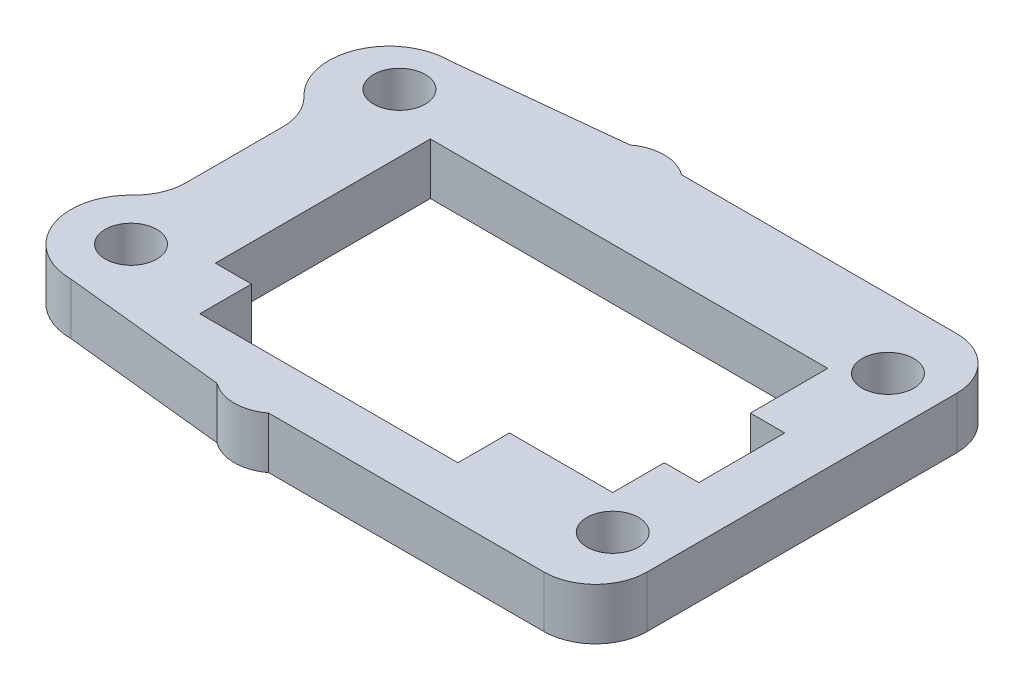
ISO-10303-21;
HEADER;
FILE_DESCRIPTION(('STEP AP214'),'2;1');
FILE_NAME('part.step','',(''),(''),'','','');
FILE_SCHEMA(('AUTOMOTIVE_DESIGN { 1 0 10303 214 1 1 1 1 }'));
ENDSEC;
DATA;
#1=APPLICATION_CONTEXT('core data for automotive mechanical design processes');
#2=APPLICATION_PROTOCOL_DEFINITION('international standard','automotive_design',2000,#1);
#3=PRODUCT_CONTEXT('',#1,'mechanical');
#4=PRODUCT('Part','Part','',(#3));
#5=PRODUCT_RELATED_PRODUCT_CATEGORY('part','',(#4));
#6=PRODUCT_DEFINITION_FORMATION('','',#4);
#7=PRODUCT_DEFINITION_CONTEXT('part definition',#1,'design');
#8=PRODUCT_DEFINITION('design','',#6,#7);
#9=PRODUCT_DEFINITION_SHAPE('','',#8);
#10=(LENGTH_UNIT() NAMED_UNIT(*) SI_UNIT(.MILLI.,.METRE.));
#11=(NAMED_UNIT(*) PLANE_ANGLE_UNIT() SI_UNIT($,.RADIAN.));
#12=(NAMED_UNIT(*) SI_UNIT($,.STERADIAN.) SOLID_ANGLE_UNIT());
#13=UNCERTAINTY_MEASURE_WITH_UNIT(LENGTH_MEASURE(1.E-05),#10,'distance_accuracy_value','');
#14=(GEOMETRIC_REPRESENTATION_CONTEXT(3) GLOBAL_UNCERTAINTY_ASSIGNED_CONTEXT((#13)) GLOBAL_UNIT_ASSIGNED_CONTEXT((#10,
#11,#12)) REPRESENTATION_CONTEXT('',''));
#15=CARTESIAN_POINT('',(0.,0.,0.));
#16=DIRECTION('',(0.,0.,1.));
#17=DIRECTION('',(1.,0.,0.));
#18=AXIS2_PLACEMENT_3D('',#15,#16,#17);
#19=CARTESIAN_POINT('',(41556.8612816487,58226.4576182088,11.5000000000123));
#20=DIRECTION('',(0.,-1.,0.));
#21=DIRECTION('',(1.,0.,0.));
#22=AXIS2_PLACEMENT_3D('',#19,#20,#21);
#23=PLANE('',#22);
#24=CARTESIAN_POINT('',(41574.3612816487,58226.4576182088,-6.4999999999884));
#25=DIRECTION('',(0.,-1.,0.));
#26=DIRECTION('',(1.,0.,0.));
#27=AXIS2_PLACEMENT_3D('',#24,#25,#26);
#28=CIRCLE('',#27,1.50000000000122);
#29=CARTESIAN_POINT('',(41575.8612816487,58226.4576182088,-6.4999999999884));
#30=VERTEX_POINT('',#29);
#31=EDGE_CURVE('E774',#30,#30,#28,.T.);
#32=ORIENTED_EDGE('',*,*,#31,.F.);
#33=EDGE_LOOP('',(#32));
#34=FACE_BOUND('',#33,.T.);
#35=DIRECTION('',(-1.,0.,0.));
#36=VECTOR('',#35,1.);
#37=CARTESIAN_POINT('',(41549.2612816491,58226.4576182088,7.50000000000739));
#38=LINE('',#37,#36);
#39=CARTESIAN_POINT('',(41551.3612816487,58226.4576182088,7.50000000000739));
#40=VERTEX_POINT('',#39);
#41=CARTESIAN_POINT('',(41549.2612816491,58226.4576182088,7.50000000000739));
#42=VERTEX_POINT('',#41);
#43=EDGE_CURVE('E219',#40,#42,#38,.T.);
#44=ORIENTED_EDGE('',*,*,#43,.F.);
#45=DIRECTION('',(0.,0.,-1.));
#46=VECTOR('',#45,1.);
#47=CARTESIAN_POINT('',(41551.3612816487,58226.4576182088,7.50000000000739));
#48=LINE('',#47,#46);
#49=CARTESIAN_POINT('',(41551.3612816487,58226.4576182088,10.5000000000075));
#50=VERTEX_POINT('',#49);
#51=EDGE_CURVE('E211',#50,#40,#48,.T.);
#52=ORIENTED_EDGE('',*,*,#51,.F.);
#53=DIRECTION('',(-1.,0.,0.));
#54=VECTOR('',#53,1.);
#55=CARTESIAN_POINT('',(41551.3612816487,58226.4576182088,10.5000000000075));
#56=LINE('',#55,#54);
#57=CARTESIAN_POINT('',(41566.3612816487,58226.4576182088,10.5000000000075));
#58=VERTEX_POINT('',#57);
#59=EDGE_CURVE('E254',#58,#50,#56,.T.);
#60=ORIENTED_EDGE('',*,*,#59,.F.);
#61=DIRECTION('',(0.,0.,1.));
#62=VECTOR('',#61,1.);
#63=CARTESIAN_POINT('',(41566.3612816487,58226.4576182088,10.5000000000075));
#64=LINE('',#63,#62);
#65=CARTESIAN_POINT('',(41566.3612816487,58226.4576182088,7.50000000000739));
#66=VERTEX_POINT('',#65);
#67=EDGE_CURVE('E252',#66,#58,#64,.T.);
#68=ORIENTED_EDGE('',*,*,#67,.F.);
#69=DIRECTION('',(-1.,0.,0.));
#70=VECTOR('',#69,1.);
#71=CARTESIAN_POINT('',(41566.3612816487,58226.4576182088,7.50000000000739));
#72=LINE('',#71,#70);
#73=CARTESIAN_POINT('',(41572.3612816487,58226.4576182088,7.50000000000739));
#74=VERTEX_POINT('',#73);
#75=EDGE_CURVE('E250',#74,#66,#72,.T.);
#76=ORIENTED_EDGE('',*,*,#75,.F.);
#77=DIRECTION('',(0.,0.,1.));
#78=VECTOR('',#77,1.);
#79=CARTESIAN_POINT('',(41572.3612816487,58226.4576182088,7.50000000000739));
#80=LINE('',#79,#78);
#81=CARTESIAN_POINT('',(41572.3612816487,58226.4576182088,4.50000000000728));
#82=VERTEX_POINT('',#81);
#83=EDGE_CURVE('E248',#82,#74,#80,.T.);
#84=ORIENTED_EDGE('',*,*,#83,.F.);
#85=DIRECTION('',(-1.,0.,0.));
#86=VECTOR('',#85,1.);
#87=CARTESIAN_POINT('',(41572.3612816487,58226.4576182088,4.50000000000728));
#88=LINE('',#87,#86);
#89=CARTESIAN_POINT('',(41574.3612816487,58226.4576182088,4.50000000000728));
#90=VERTEX_POINT('',#89);
#91=EDGE_CURVE('E246',#90,#82,#88,.T.);
#92=ORIENTED_EDGE('',*,*,#91,.F.);
#93=DIRECTION('',(0.,0.,1.));
#94=VECTOR('',#93,1.);
#95=CARTESIAN_POINT('',(41574.3612816487,58226.4576182088,4.50000000000728));
#96=LINE('',#95,#94);
#97=CARTESIAN_POINT('',(41574.3612816487,58226.4576182088,-0.499999999988177));
#98=VERTEX_POINT('',#97);
#99=EDGE_CURVE('E244',#98,#90,#96,.T.);
#100=ORIENTED_EDGE('',*,*,#99,.F.);
#101=DIRECTION('',(1.,0.,0.));
#102=VECTOR('',#101,1.);
#103=CARTESIAN_POINT('',(41574.3612816487,58226.4576182088,-0.499999999988177));
#104=LINE('',#103,#102);
#105=CARTESIAN_POINT('',(41572.3612816487,58226.4576182088,-0.499999999988177));
#106=VERTEX_POINT('',#105);
#107=EDGE_CURVE('E242',#106,#98,#104,.T.);
#108=ORIENTED_EDGE('',*,*,#107,.F.);
#109=DIRECTION('',(0.,0.,1.));
#110=VECTOR('',#109,1.);
#111=CARTESIAN_POINT('',(41572.3612816487,58226.4576182088,-0.499999999988177));
#112=LINE('',#111,#110);
#113=CARTESIAN_POINT('',(41572.3612816487,58226.4576182088,-5.00000000091916));
#114=VERTEX_POINT('',#113);
#115=EDGE_CURVE('E240',#114,#106,#112,.T.);
#116=ORIENTED_EDGE('',*,*,#115,.F.);
#117=DIRECTION('',(1.,0.,0.));
#118=VECTOR('',#117,1.);
#119=CARTESIAN_POINT('',(41572.3612816487,58226.4576182088,-5.00000000091916));
#120=LINE('',#119,#118);
#121=CARTESIAN_POINT('',(41549.2612816491,58226.4576182088,-5.00000000091916));
#122=VERTEX_POINT('',#121);
#123=EDGE_CURVE('E235',#122,#114,#120,.T.);
#124=ORIENTED_EDGE('',*,*,#123,.F.);
#125=DIRECTION('',(0.,0.,-1.));
#126=VECTOR('',#125,1.);
#127=CARTESIAN_POINT('',(41549.2612816491,58226.4576182088,-5.00000000091916));
#128=LINE('',#127,#126);
#129=EDGE_CURVE('E233',#42,#122,#128,.T.);
#130=ORIENTED_EDGE('',*,*,#129,.F.);
#131=EDGE_LOOP('',(#44,#52,#60,#68,#76,#84,#92,#100,#108,#116,#124,#130));
#132=FACE_BOUND('',#131,.T.);
#133=CARTESIAN_POINT('',(41545.8612816487,58226.4576182088,9.00000000000745));
#134=DIRECTION('',(0.,-1.,0.));
#135=DIRECTION('',(1.,0.,0.));
#136=AXIS2_PLACEMENT_3D('',#133,#134,#135);
#137=CIRCLE('',#136,1.50000000000122);
#138=CARTESIAN_POINT('',(41547.3612816487,58226.4576182088,9.00000000000745));
#139=VERTEX_POINT('',#138);
#140=EDGE_CURVE('E307',#139,#139,#137,.T.);
#141=ORIENTED_EDGE('',*,*,#140,.F.);
#142=EDGE_LOOP('',(#141));
#143=FACE_BOUND('',#142,.T.);
#144=CARTESIAN_POINT('',(41556.8612816487,58226.4576182088,11.5000000000123));
#145=DIRECTION('',(0.,-1.,0.));
#146=DIRECTION('',(1.,0.,0.));
#147=AXIS2_PLACEMENT_3D('',#144,#145,#146);
#148=CIRCLE('',#147,2.49999999999346);
#149=CARTESIAN_POINT('',(41558.3612816487,58226.4576182088,13.5000000000076));
#150=VERTEX_POINT('',#149);
#151=CARTESIAN_POINT('',(41555.3612816487,58226.4576182088,13.5000000000005));
#152=VERTEX_POINT('',#151);
#153=EDGE_CURVE('E313',#150,#152,#148,.T.);
#154=ORIENTED_EDGE('',*,*,#153,.T.);
#155=DIRECTION('',(-0.994505452920452,0.,-0.104684784527103));
#156=VECTOR('',#155,1.);
#157=CARTESIAN_POINT('',(41555.3612816487,58226.4576182088,13.5000000000005));
#158=LINE('',#157,#156);
#159=CARTESIAN_POINT('',(41545.8612816496,58226.4576182088,12.5000000000099));
#160=VERTEX_POINT('',#159);
#161=EDGE_CURVE('E316',#152,#160,#158,.T.);
#162=ORIENTED_EDGE('',*,*,#161,.T.);
#163=CARTESIAN_POINT('',(41545.8612816487,58226.4576182088,9.00000000000745));
#164=DIRECTION('',(0.,-1.,0.));
#165=DIRECTION('',(1.,0.,0.));
#166=AXIS2_PLACEMENT_3D('',#163,#164,#165);
#167=CIRCLE('',#166,3.50000000000177);
#168=CARTESIAN_POINT('',(41543.4382047256,58226.4576182088,6.4743915140113));
#169=VERTEX_POINT('',#168);
#170=EDGE_CURVE('E319',#160,#169,#167,.T.);
#171=ORIENTED_EDGE('',*,*,#170,.T.);
#172=CARTESIAN_POINT('',(41541.3612816487,58226.4576182088,4.30958424043837));
#173=DIRECTION('',(0.,1.,0.));
#174=DIRECTION('',(1.,0.,0.));
#175=AXIS2_PLACEMENT_3D('',#172,#173,#174);
#176=CIRCLE('',#175,2.99999999981546);
#177=CARTESIAN_POINT('',(41544.3612816485,58226.4576182088,4.30958424043837));
#178=VERTEX_POINT('',#177);
#179=EDGE_CURVE('E321',#169,#178,#176,.T.);
#180=ORIENTED_EDGE('',*,*,#179,.T.);
#181=DIRECTION('',(3.28769482401258E-11,0.,-1.));
#182=VECTOR('',#181,1.);
#183=CARTESIAN_POINT('',(41544.3612816485,58226.4576182088,4.30958424043837));
#184=LINE('',#183,#182);
#185=CARTESIAN_POINT('',(41544.3612816486,58226.4576182088,-1.30958424041694));
#186=VERTEX_POINT('',#185);
#187=EDGE_CURVE('E323',#178,#186,#184,.T.);
#188=ORIENTED_EDGE('',*,*,#187,.T.);
#189=CARTESIAN_POINT('',(41541.3612816487,58226.4576182088,-1.30958424041694));
#190=DIRECTION('',(0.,1.,0.));
#191=DIRECTION('',(1.,0.,0.));
#192=AXIS2_PLACEMENT_3D('',#189,#190,#191);
#193=CIRCLE('',#192,2.99999999991541);
#194=CARTESIAN_POINT('',(41543.4382047256,58226.4576182088,-3.47439151400408));
#195=VERTEX_POINT('',#194);
#196=EDGE_CURVE('E325',#186,#195,#193,.T.);
#197=ORIENTED_EDGE('',*,*,#196,.T.);
#198=CARTESIAN_POINT('',(41545.8612816487,58226.4576182088,-5.99999999999312));
#199=DIRECTION('',(0.,-1.,0.));
#200=DIRECTION('',(1.,0.,0.));
#201=AXIS2_PLACEMENT_3D('',#198,#199,#200);
#202=CIRCLE('',#201,3.49999999999319);
#203=CARTESIAN_POINT('',(41545.8612816487,58226.4576182088,-9.49999999998852));
#204=VERTEX_POINT('',#203);
#205=EDGE_CURVE('E327',#195,#204,#202,.T.);
#206=ORIENTED_EDGE('',*,*,#205,.T.);
#207=DIRECTION('',(0.994505452921357,0.,-0.104684784518507));
#208=VECTOR('',#207,1.);
#209=CARTESIAN_POINT('',(41545.8612816487,58226.4576182088,-9.49999999998852));
#210=LINE('',#209,#208);
#211=CARTESIAN_POINT('',(41555.3612816487,58226.4576182088,-10.4999999999933));
#212=VERTEX_POINT('',#211);
#213=EDGE_CURVE('E329',#204,#212,#210,.T.);
#214=ORIENTED_EDGE('',*,*,#213,.T.);
#215=CARTESIAN_POINT('',(41556.8612816487,58226.4576182088,-8.49999999999085));
#216=DIRECTION('',(0.,-1.,0.));
#217=DIRECTION('',(1.,0.,0.));
#218=AXIS2_PLACEMENT_3D('',#215,#216,#217);
#219=CIRCLE('',#218,2.50000000000199);
#220=CARTESIAN_POINT('',(41558.3612816487,58226.4576182088,-10.4999999999933));
#221=VERTEX_POINT('',#220);
#222=EDGE_CURVE('E331',#212,#221,#219,.T.);
#223=ORIENTED_EDGE('',*,*,#222,.T.);
#224=DIRECTION('',(1.,0.,0.));
#225=VECTOR('',#224,1.);
#226=CARTESIAN_POINT('',(41558.3612816487,58226.4576182088,-10.4999999999933));
#227=LINE('',#226,#225);
#228=CARTESIAN_POINT('',(41574.3612816487,58226.4576182088,-10.4999999999933));
#229=VERTEX_POINT('',#228);
#230=EDGE_CURVE('E333',#221,#229,#227,.T.);
#231=ORIENTED_EDGE('',*,*,#230,.T.);
#232=CARTESIAN_POINT('',(41574.3612816487,58226.4576182088,-7.49999999999318));
#233=DIRECTION('',(0.,-1.,0.));
#234=DIRECTION('',(1.,0.,0.));
#235=AXIS2_PLACEMENT_3D('',#232,#233,#234);
#236=CIRCLE('',#235,3.00000000000011);
#237=CARTESIAN_POINT('',(41577.3612816487,58226.4576182088,-7.49999999999318));
#238=VERTEX_POINT('',#237);
#239=EDGE_CURVE('E335',#229,#238,#236,.T.);
#240=ORIENTED_EDGE('',*,*,#239,.T.);
#241=DIRECTION('',(0.,0.,1.));
#242=VECTOR('',#241,1.);
#243=CARTESIAN_POINT('',(41577.3612816487,58226.4576182088,-7.49999999999318));
#244=LINE('',#243,#242);
#245=CARTESIAN_POINT('',(41577.3612816487,58226.4576182088,10.5000000000075));
#246=VERTEX_POINT('',#245);
#247=EDGE_CURVE('E337',#238,#246,#244,.T.);
#248=ORIENTED_EDGE('',*,*,#247,.T.);
#249=CARTESIAN_POINT('',(41574.3612816487,58226.4576182088,10.5000000000075));
#250=DIRECTION('',(0.,-1.,0.));
#251=DIRECTION('',(1.,0.,0.));
#252=AXIS2_PLACEMENT_3D('',#249,#250,#251);
#253=CIRCLE('',#252,3.00000000000011);
#254=CARTESIAN_POINT('',(41574.3612816487,58226.4576182088,13.5000000000076));
#255=VERTEX_POINT('',#254);
#256=EDGE_CURVE('E339',#246,#255,#253,.T.);
#257=ORIENTED_EDGE('',*,*,#256,.T.);
#258=DIRECTION('',(-1.,0.,0.));
#259=VECTOR('',#258,1.);
#260=CARTESIAN_POINT('',(41558.3612816487,58226.4576182088,13.5000000000076));
#261=LINE('',#260,#259);
#262=EDGE_CURVE('E341',#255,#150,#261,.T.);
#263=ORIENTED_EDGE('',*,*,#262,.T.);
#264=EDGE_LOOP('',(#154,#162,#171,#180,#188,#197,#206,#214,#223,#231,#240,#248,#257,#263));
#265=FACE_BOUND('',#264,.T.);
#266=CARTESIAN_POINT('',(41545.8612816487,58226.4576182088,-6.60000000008409));
#267=DIRECTION('',(0.,-1.,0.));
#268=DIRECTION('',(1.,0.,0.));
#269=AXIS2_PLACEMENT_3D('',#266,#267,#268);
#270=CIRCLE('',#269,1.50000000000122);
#271=CARTESIAN_POINT('',(41547.3612816487,58226.4576182088,-6.60000000008409));
#272=VERTEX_POINT('',#271);
#273=EDGE_CURVE('E257',#272,#272,#270,.T.);
#274=ORIENTED_EDGE('',*,*,#273,.F.);
#275=EDGE_LOOP('',(#274));
#276=FACE_BOUND('',#275,.T.);
#277=CARTESIAN_POINT('',(41574.3612816487,58226.4576182088,9.50000000000983));
#278=DIRECTION('',(0.,-1.,0.));
#279=DIRECTION('',(1.,0.,0.));
#280=AXIS2_PLACEMENT_3D('',#277,#278,#279);
#281=CIRCLE('',#280,1.50000000000122);
#282=CARTESIAN_POINT('',(41575.8612816487,58226.4576182088,9.50000000000983));
#283=VERTEX_POINT('',#282);
#284=EDGE_CURVE('E765',#283,#283,#281,.T.);
#285=ORIENTED_EDGE('',*,*,#284,.F.);
#286=EDGE_LOOP('',(#285));
#287=FACE_BOUND('',#286,.T.);
#288=ADVANCED_FACE('F38',(#34,#132,#143,#265,#276,#287),#23,.T.);
#289=CARTESIAN_POINT('',(41556.8612816487,58229.4576182088,11.5000000000123));
#290=DIRECTION('',(0.,-1.,0.));
#291=DIRECTION('',(1.,0.,0.));
#292=AXIS2_PLACEMENT_3D('',#289,#290,#291);
#293=PLANE('',#292);
#294=CARTESIAN_POINT('',(41545.8612816487,58229.4576182088,9.00000000000745));
#295=DIRECTION('',(0.,-1.,0.));
#296=DIRECTION('',(1.,0.,0.));
#297=AXIS2_PLACEMENT_3D('',#294,#295,#296);
#298=CIRCLE('',#297,1.50000000000122);
#299=CARTESIAN_POINT('',(41547.3612816487,58229.4576182088,9.00000000000745));
#300=VERTEX_POINT('',#299);
#301=EDGE_CURVE('E227',#300,#300,#298,.T.);
#302=ORIENTED_EDGE('',*,*,#301,.T.);
#303=EDGE_LOOP('',(#302));
#304=FACE_BOUND('',#303,.T.);
#305=CARTESIAN_POINT('',(41556.8612816487,58229.4576182088,11.5000000000123));
#306=DIRECTION('',(0.,-1.,0.));
#307=DIRECTION('',(1.,0.,0.));
#308=AXIS2_PLACEMENT_3D('',#305,#306,#307);
#309=CIRCLE('',#308,2.49999999999346);
#310=CARTESIAN_POINT('',(41558.3612816487,58229.4576182088,13.5000000000076));
#311=VERTEX_POINT('',#310);
#312=CARTESIAN_POINT('',(41555.3612816487,58229.4576182088,13.5000000000005));
#313=VERTEX_POINT('',#312);
#314=EDGE_CURVE('E310',#311,#313,#309,.T.);
#315=ORIENTED_EDGE('',*,*,#314,.F.);
#316=DIRECTION('',(-1.,0.,0.));
#317=VECTOR('',#316,1.);
#318=CARTESIAN_POINT('',(41558.3612816487,58229.4576182088,13.5000000000076));
#319=LINE('',#318,#317);
#320=CARTESIAN_POINT('',(41574.3612816487,58229.4576182088,13.5000000000076));
#321=VERTEX_POINT('',#320);
#322=EDGE_CURVE('E317',#321,#311,#319,.T.);
#323=ORIENTED_EDGE('',*,*,#322,.F.);
#324=CARTESIAN_POINT('',(41574.3612816487,58229.4576182088,10.5000000000075));
#325=DIRECTION('',(0.,-1.,0.));
#326=DIRECTION('',(1.,0.,0.));
#327=AXIS2_PLACEMENT_3D('',#324,#325,#326);
#328=CIRCLE('',#327,3.00000000000011);
#329=CARTESIAN_POINT('',(41577.3612816487,58229.4576182088,10.5000000000075));
#330=VERTEX_POINT('',#329);
#331=EDGE_CURVE('E368',#330,#321,#328,.T.);
#332=ORIENTED_EDGE('',*,*,#331,.F.);
#333=DIRECTION('',(0.,0.,1.));
#334=VECTOR('',#333,1.);
#335=CARTESIAN_POINT('',(41577.3612816487,58229.4576182088,-7.49999999999318));
#336=LINE('',#335,#334);
#337=CARTESIAN_POINT('',(41577.3612816487,58229.4576182088,-7.49999999999318));
#338=VERTEX_POINT('',#337);
#339=EDGE_CURVE('E366',#338,#330,#336,.T.);
#340=ORIENTED_EDGE('',*,*,#339,.F.);
#341=CARTESIAN_POINT('',(41574.3612816487,58229.4576182088,-7.49999999999318));
#342=DIRECTION('',(0.,-1.,0.));
#343=DIRECTION('',(1.,0.,0.));
#344=AXIS2_PLACEMENT_3D('',#341,#342,#343);
#345=CIRCLE('',#344,3.00000000000011);
#346=CARTESIAN_POINT('',(41574.3612816487,58229.4576182088,-10.4999999999933));
#347=VERTEX_POINT('',#346);
#348=EDGE_CURVE('E364',#347,#338,#345,.T.);
#349=ORIENTED_EDGE('',*,*,#348,.F.);
#350=DIRECTION('',(1.,0.,0.));
#351=VECTOR('',#350,1.);
#352=CARTESIAN_POINT('',(41558.3612816487,58229.4576182088,-10.4999999999933));
#353=LINE('',#352,#351);
#354=CARTESIAN_POINT('',(41558.3612816487,58229.4576182088,-10.4999999999933));
#355=VERTEX_POINT('',#354);
#356=EDGE_CURVE('E362',#355,#347,#353,.T.);
#357=ORIENTED_EDGE('',*,*,#356,.F.);
#358=CARTESIAN_POINT('',(41556.8612816487,58229.4576182088,-8.49999999999085));
#359=DIRECTION('',(0.,-1.,0.));
#360=DIRECTION('',(1.,0.,0.));
#361=AXIS2_PLACEMENT_3D('',#358,#359,#360);
#362=CIRCLE('',#361,2.50000000000199);
#363=CARTESIAN_POINT('',(41555.3612816487,58229.4576182088,-10.4999999999933));
#364=VERTEX_POINT('',#363);
#365=EDGE_CURVE('E360',#364,#355,#362,.T.);
#366=ORIENTED_EDGE('',*,*,#365,.F.);
#367=DIRECTION('',(0.994505452921357,0.,-0.104684784518507));
#368=VECTOR('',#367,1.);
#369=CARTESIAN_POINT('',(41545.8612816487,58229.4576182088,-9.49999999998852));
#370=LINE('',#369,#368);
#371=CARTESIAN_POINT('',(41545.8612816487,58229.4576182088,-9.49999999998852));
#372=VERTEX_POINT('',#371);
#373=EDGE_CURVE('E358',#372,#364,#370,.T.);
#374=ORIENTED_EDGE('',*,*,#373,.F.);
#375=CARTESIAN_POINT('',(41545.8612816487,58229.4576182088,-5.99999999999312));
#376=DIRECTION('',(0.,-1.,0.));
#377=DIRECTION('',(1.,0.,0.));
#378=AXIS2_PLACEMENT_3D('',#375,#376,#377);
#379=CIRCLE('',#378,3.49999999999319);
#380=CARTESIAN_POINT('',(41543.4382047256,58229.4576182088,-3.47439151400408));
#381=VERTEX_POINT('',#380);
#382=EDGE_CURVE('E356',#381,#372,#379,.T.);
#383=ORIENTED_EDGE('',*,*,#382,.F.);
#384=CARTESIAN_POINT('',(41541.3612816487,58229.4576182088,-1.30958424041694));
#385=DIRECTION('',(0.,1.,0.));
#386=DIRECTION('',(1.,0.,0.));
#387=AXIS2_PLACEMENT_3D('',#384,#385,#386);
#388=CIRCLE('',#387,2.99999999991541);
#389=CARTESIAN_POINT('',(41544.3612816486,58229.4576182088,-1.30958424041694));
#390=VERTEX_POINT('',#389);
#391=EDGE_CURVE('E354',#390,#381,#388,.T.);
#392=ORIENTED_EDGE('',*,*,#391,.F.);
#393=DIRECTION('',(3.28769482401258E-11,0.,-1.));
#394=VECTOR('',#393,1.);
#395=CARTESIAN_POINT('',(41544.3612816485,58229.4576182088,4.30958424043837));
#396=LINE('',#395,#394);
#397=CARTESIAN_POINT('',(41544.3612816485,58229.4576182088,4.30958424043837));
#398=VERTEX_POINT('',#397);
#399=EDGE_CURVE('E352',#398,#390,#396,.T.);
#400=ORIENTED_EDGE('',*,*,#399,.F.);
#401=CARTESIAN_POINT('',(41541.3612816487,58229.4576182088,4.30958424043837));
#402=DIRECTION('',(0.,1.,0.));
#403=DIRECTION('',(1.,0.,0.));
#404=AXIS2_PLACEMENT_3D('',#401,#402,#403);
#405=CIRCLE('',#404,2.99999999981546);
#406=CARTESIAN_POINT('',(41543.4382047256,58229.4576182088,6.4743915140113));
#407=VERTEX_POINT('',#406);
#408=EDGE_CURVE('E350',#407,#398,#405,.T.);
#409=ORIENTED_EDGE('',*,*,#408,.F.);
#410=CARTESIAN_POINT('',(41545.8612816487,58229.4576182088,9.00000000000745));
#411=DIRECTION('',(0.,-1.,0.));
#412=DIRECTION('',(1.,0.,0.));
#413=AXIS2_PLACEMENT_3D('',#410,#411,#412);
#414=CIRCLE('',#413,3.50000000000177);
#415=CARTESIAN_POINT('',(41545.8612816496,58229.4576182088,12.5000000000099));
#416=VERTEX_POINT('',#415);
#417=EDGE_CURVE('E348',#416,#407,#414,.T.);
#418=ORIENTED_EDGE('',*,*,#417,.F.);
#419=DIRECTION('',(-0.994505452920452,0.,-0.104684784527103));
#420=VECTOR('',#419,1.);
#421=CARTESIAN_POINT('',(41555.3612816487,58229.4576182088,13.5000000000005));
#422=LINE('',#421,#420);
#423=EDGE_CURVE('E346',#313,#416,#422,.T.);
#424=ORIENTED_EDGE('',*,*,#423,.F.);
#425=EDGE_LOOP('',(#315,#323,#332,#340,#349,#357,#366,#374,#383,#392,#400,#409,#418,#424));
#426=FACE_BOUND('',#425,.T.);
#427=DIRECTION('',(0.,0.,-1.));
#428=VECTOR('',#427,1.);
#429=CARTESIAN_POINT('',(41551.3612816487,58229.4576182088,7.50000000000739));
#430=LINE('',#429,#428);
#431=CARTESIAN_POINT('',(41551.3612816487,58229.4576182088,10.5000000000075));
#432=VERTEX_POINT('',#431);
#433=CARTESIAN_POINT('',(41551.3612816487,58229.4576182088,7.50000000000739));
#434=VERTEX_POINT('',#433);
#435=EDGE_CURVE('E61',#432,#434,#430,.T.);
#436=ORIENTED_EDGE('',*,*,#435,.T.);
#437=DIRECTION('',(-1.,0.,0.));
#438=VECTOR('',#437,1.);
#439=CARTESIAN_POINT('',(41549.2612816491,58229.4576182088,7.50000000000739));
#440=LINE('',#439,#438);
#441=CARTESIAN_POINT('',(41549.2612816491,58229.4576182088,7.50000000000739));
#442=VERTEX_POINT('',#441);
#443=EDGE_CURVE('E226',#434,#442,#440,.T.);
#444=ORIENTED_EDGE('',*,*,#443,.T.);
#445=DIRECTION('',(0.,0.,-1.));
#446=VECTOR('',#445,1.);
#447=CARTESIAN_POINT('',(41549.2612816491,58229.4576182088,-5.00000000091916));
#448=LINE('',#447,#446);
#449=CARTESIAN_POINT('',(41549.2612816491,58229.4576182088,-5.00000000091916));
#450=VERTEX_POINT('',#449);
#451=EDGE_CURVE('E259',#442,#450,#448,.T.);
#452=ORIENTED_EDGE('',*,*,#451,.T.);
#453=DIRECTION('',(1.,0.,0.));
#454=VECTOR('',#453,1.);
#455=CARTESIAN_POINT('',(41572.3612816487,58229.4576182088,-5.00000000091916));
#456=LINE('',#455,#454);
#457=CARTESIAN_POINT('',(41572.3612816487,58229.4576182088,-5.00000000091916));
#458=VERTEX_POINT('',#457);
#459=EDGE_CURVE('E262',#450,#458,#456,.T.);
#460=ORIENTED_EDGE('',*,*,#459,.T.);
#461=DIRECTION('',(0.,0.,1.));
#462=VECTOR('',#461,1.);
#463=CARTESIAN_POINT('',(41572.3612816487,58229.4576182088,-0.499999999988177));
#464=LINE('',#463,#462);
#465=CARTESIAN_POINT('',(41572.3612816487,58229.4576182088,-0.499999999988177));
#466=VERTEX_POINT('',#465);
#467=EDGE_CURVE('E265',#458,#466,#464,.T.);
#468=ORIENTED_EDGE('',*,*,#467,.T.);
#469=DIRECTION('',(1.,0.,0.));
#470=VECTOR('',#469,1.);
#471=CARTESIAN_POINT('',(41574.3612816487,58229.4576182088,-0.499999999988177));
#472=LINE('',#471,#470);
#473=CARTESIAN_POINT('',(41574.3612816487,58229.4576182088,-0.499999999988177));
#474=VERTEX_POINT('',#473);
#475=EDGE_CURVE('E268',#466,#474,#472,.T.);
#476=ORIENTED_EDGE('',*,*,#475,.T.);
#477=DIRECTION('',(0.,0.,1.));
#478=VECTOR('',#477,1.);
#479=CARTESIAN_POINT('',(41574.3612816487,58229.4576182088,4.50000000000728));
#480=LINE('',#479,#478);
#481=CARTESIAN_POINT('',(41574.3612816487,58229.4576182088,4.50000000000728));
#482=VERTEX_POINT('',#481);
#483=EDGE_CURVE('E271',#474,#482,#480,.T.);
#484=ORIENTED_EDGE('',*,*,#483,.T.);
#485=DIRECTION('',(-1.,0.,0.));
#486=VECTOR('',#485,1.);
#487=CARTESIAN_POINT('',(41572.3612816487,58229.4576182088,4.50000000000728));
#488=LINE('',#487,#486);
#489=CARTESIAN_POINT('',(41572.3612816487,58229.4576182088,4.50000000000728));
#490=VERTEX_POINT('',#489);
#491=EDGE_CURVE('E274',#482,#490,#488,.T.);
#492=ORIENTED_EDGE('',*,*,#491,.T.);
#493=DIRECTION('',(0.,0.,1.));
#494=VECTOR('',#493,1.);
#495=CARTESIAN_POINT('',(41572.3612816487,58229.4576182088,7.50000000000739));
#496=LINE('',#495,#494);
#497=CARTESIAN_POINT('',(41572.3612816487,58229.4576182088,7.50000000000739));
#498=VERTEX_POINT('',#497);
#499=EDGE_CURVE('E277',#490,#498,#496,.T.);
#500=ORIENTED_EDGE('',*,*,#499,.T.);
#501=DIRECTION('',(-1.,0.,0.));
#502=VECTOR('',#501,1.);
#503=CARTESIAN_POINT('',(41566.3612816487,58229.4576182088,7.50000000000739));
#504=LINE('',#503,#502);
#505=CARTESIAN_POINT('',(41566.3612816487,58229.4576182088,7.50000000000739));
#506=VERTEX_POINT('',#505);
#507=EDGE_CURVE('E280',#498,#506,#504,.T.);
#508=ORIENTED_EDGE('',*,*,#507,.T.);
#509=DIRECTION('',(0.,0.,1.));
#510=VECTOR('',#509,1.);
#511=CARTESIAN_POINT('',(41566.3612816487,58229.4576182088,10.5000000000075));
#512=LINE('',#511,#510);
#513=CARTESIAN_POINT('',(41566.3612816487,58229.4576182088,10.5000000000075));
#514=VERTEX_POINT('',#513);
#515=EDGE_CURVE('E283',#506,#514,#512,.T.);
#516=ORIENTED_EDGE('',*,*,#515,.T.);
#517=DIRECTION('',(-1.,0.,0.));
#518=VECTOR('',#517,1.);
#519=CARTESIAN_POINT('',(41551.3612816487,58229.4576182088,10.5000000000075));
#520=LINE('',#519,#518);
#521=EDGE_CURVE('E220',#514,#432,#520,.T.);
#522=ORIENTED_EDGE('',*,*,#521,.T.);
#523=EDGE_LOOP('',(#436,#444,#452,#460,#468,#476,#484,#492,#500,#508,#516,#522));
#524=FACE_BOUND('',#523,.T.);
#525=CARTESIAN_POINT('',(41545.8612816487,58229.4576182088,-6.60000000008409));
#526=DIRECTION('',(0.,-1.,0.));
#527=DIRECTION('',(1.,0.,0.));
#528=AXIS2_PLACEMENT_3D('',#525,#526,#527);
#529=CIRCLE('',#528,1.50000000000122);
#530=CARTESIAN_POINT('',(41547.3612816487,58229.4576182088,-6.60000000008409));
#531=VERTEX_POINT('',#530);
#532=EDGE_CURVE('E777',#531,#531,#529,.T.);
#533=ORIENTED_EDGE('',*,*,#532,.T.);
#534=EDGE_LOOP('',(#533));
#535=FACE_BOUND('',#534,.T.);
#536=CARTESIAN_POINT('',(41574.3612816487,58229.4576182088,-6.4999999999884));
#537=DIRECTION('',(0.,-1.,0.));
#538=DIRECTION('',(1.,0.,0.));
#539=AXIS2_PLACEMENT_3D('',#536,#537,#538);
#540=CIRCLE('',#539,1.50000000000122);
#541=CARTESIAN_POINT('',(41575.8612816487,58229.4576182088,-6.4999999999884));
#542=VERTEX_POINT('',#541);
#543=EDGE_CURVE('E771',#542,#542,#540,.T.);
#544=ORIENTED_EDGE('',*,*,#543,.T.);
#545=EDGE_LOOP('',(#544));
#546=FACE_BOUND('',#545,.T.);
#547=CARTESIAN_POINT('',(41574.3612816487,58229.4576182088,9.50000000000983));
#548=DIRECTION('',(0.,-1.,0.));
#549=DIRECTION('',(1.,0.,0.));
#550=AXIS2_PLACEMENT_3D('',#547,#548,#549);
#551=CIRCLE('',#550,1.50000000000122);
#552=CARTESIAN_POINT('',(41575.8612816487,58229.4576182088,9.50000000000983));
#553=VERTEX_POINT('',#552);
#554=EDGE_CURVE('E768',#553,#553,#551,.T.);
#555=ORIENTED_EDGE('',*,*,#554,.T.);
#556=EDGE_LOOP('',(#555));
#557=FACE_BOUND('',#556,.T.);
#558=ADVANCED_FACE('F416',(#304,#426,#524,#535,#546,#557),#293,.F.);
#559=CARTESIAN_POINT('',(41556.8612816487,58226.4576182088,11.5000000000123));
#560=DIRECTION('',(0.,1.,0.));
#561=DIRECTION('',(-1.,0.,0.));
#562=AXIS2_PLACEMENT_3D('',#559,#560,#561);
#563=CYLINDRICAL_SURFACE('',#562,2.49999999999346);
#564=ORIENTED_EDGE('',*,*,#314,.T.);
#565=DIRECTION('',(0.,1.,0.));
#566=VECTOR('',#565,1.);
#567=CARTESIAN_POINT('',(41555.3612816487,58226.4576182088,13.5000000000005));
#568=LINE('',#567,#566);
#569=EDGE_CURVE('E11',#152,#313,#568,.T.);
#570=ORIENTED_EDGE('',*,*,#569,.F.);
#571=ORIENTED_EDGE('',*,*,#153,.F.);
#572=DIRECTION('',(0.,1.,0.));
#573=VECTOR('',#572,1.);
#574=CARTESIAN_POINT('',(41558.3612816487,58226.4576182088,13.5000000000076));
#575=LINE('',#574,#573);
#576=EDGE_CURVE('E343',#150,#311,#575,.T.);
#577=ORIENTED_EDGE('',*,*,#576,.T.);
#578=EDGE_LOOP('',(#564,#570,#571,#577));
#579=FACE_BOUND('',#578,.T.);
#580=ADVANCED_FACE('F40',(#579),#563,.T.);
#581=CARTESIAN_POINT('',(41555.3612816487,58226.4576182088,13.5000000000005));
#582=DIRECTION('',(0.104684784527103,0.,-0.994505452920452));
#583=DIRECTION('',(0.994505452920452,0.,0.104684784527103));
#584=AXIS2_PLACEMENT_3D('',#581,#582,#583);
#585=PLANE('',#584);
#586=ORIENTED_EDGE('',*,*,#423,.T.);
#587=DIRECTION('',(0.,1.,0.));
#588=VECTOR('',#587,1.);
#589=CARTESIAN_POINT('',(41545.8612816496,58226.4576182088,12.5000000000099));
#590=LINE('',#589,#588);
#591=EDGE_CURVE('E46',#160,#416,#590,.T.);
#592=ORIENTED_EDGE('',*,*,#591,.F.);
#593=ORIENTED_EDGE('',*,*,#161,.F.);
#594=ORIENTED_EDGE('',*,*,#569,.T.);
#595=EDGE_LOOP('',(#586,#592,#593,#594));
#596=FACE_BOUND('',#595,.T.);
#597=ADVANCED_FACE('F434',(#596),#585,.F.);
#598=CARTESIAN_POINT('',(41545.8612816487,58226.4576182088,9.00000000000745));
#599=DIRECTION('',(0.,1.,0.));
#600=DIRECTION('',(-1.,0.,0.));
#601=AXIS2_PLACEMENT_3D('',#598,#599,#600);
#602=CYLINDRICAL_SURFACE('',#601,3.50000000000177);
#603=ORIENTED_EDGE('',*,*,#417,.T.);
#604=DIRECTION('',(0.,1.,0.));
#605=VECTOR('',#604,1.);
#606=CARTESIAN_POINT('',(41543.4382047256,58226.4576182088,6.4743915140113));
#607=LINE('',#606,#605);
#608=EDGE_CURVE('E403',#169,#407,#607,.T.);
#609=ORIENTED_EDGE('',*,*,#608,.F.);
#610=ORIENTED_EDGE('',*,*,#170,.F.);
#611=ORIENTED_EDGE('',*,*,#591,.T.);
#612=EDGE_LOOP('',(#603,#609,#610,#611));
#613=FACE_BOUND('',#612,.T.);
#614=ADVANCED_FACE('F410',(#613),#602,.T.);
#615=CARTESIAN_POINT('',(41541.3612816487,58226.4576182088,4.30958424043837));
#616=DIRECTION('',(0.,1.,0.));
#617=DIRECTION('',(-1.,0.,0.));
#618=AXIS2_PLACEMENT_3D('',#615,#616,#617);
#619=CYLINDRICAL_SURFACE('',#618,2.99999999981546);
#620=ORIENTED_EDGE('',*,*,#408,.T.);
#621=DIRECTION('',(0.,1.,0.));
#622=VECTOR('',#621,1.);
#623=CARTESIAN_POINT('',(41544.3612816485,58226.4576182088,4.30958424043837));
#624=LINE('',#623,#622);
#625=EDGE_CURVE('E400',#178,#398,#624,.T.);
#626=ORIENTED_EDGE('',*,*,#625,.F.);
#627=ORIENTED_EDGE('',*,*,#179,.F.);
#628=ORIENTED_EDGE('',*,*,#608,.T.);
#629=EDGE_LOOP('',(#620,#626,#627,#628));
#630=FACE_BOUND('',#629,.T.);
#631=ADVANCED_FACE('F422',(#630),#619,.F.);
#632=CARTESIAN_POINT('',(41544.3612816485,58226.4576182088,4.30958424043837));
#633=DIRECTION('',(1.,0.,3.28769482401258E-11));
#634=DIRECTION('',(-3.28769482401258E-11,0.,1.));
#635=AXIS2_PLACEMENT_3D('',#632,#633,#634);
#636=PLANE('',#635);
#637=ORIENTED_EDGE('',*,*,#399,.T.);
#638=DIRECTION('',(0.,1.,0.));
#639=VECTOR('',#638,1.);
#640=CARTESIAN_POINT('',(41544.3612816486,58226.4576182088,-1.30958424041694));
#641=LINE('',#640,#639);
#642=EDGE_CURVE('E397',#186,#390,#641,.T.);
#643=ORIENTED_EDGE('',*,*,#642,.F.);
#644=ORIENTED_EDGE('',*,*,#187,.F.);
#645=ORIENTED_EDGE('',*,*,#625,.T.);
#646=EDGE_LOOP('',(#637,#643,#644,#645));
#647=FACE_BOUND('',#646,.T.);
#648=ADVANCED_FACE('F426',(#647),#636,.F.);
#649=CARTESIAN_POINT('',(41541.3612816487,58226.4576182088,-1.30958424041694));
#650=DIRECTION('',(0.,1.,0.));
#651=DIRECTION('',(-1.,0.,0.));
#652=AXIS2_PLACEMENT_3D('',#649,#650,#651);
#653=CYLINDRICAL_SURFACE('',#652,2.99999999991541);
#654=ORIENTED_EDGE('',*,*,#391,.T.);
#655=DIRECTION('',(0.,1.,0.));
#656=VECTOR('',#655,1.);
#657=CARTESIAN_POINT('',(41543.4382047256,58226.4576182088,-3.47439151400408));
#658=LINE('',#657,#656);
#659=EDGE_CURVE('E394',#195,#381,#658,.T.);
#660=ORIENTED_EDGE('',*,*,#659,.F.);
#661=ORIENTED_EDGE('',*,*,#196,.F.);
#662=ORIENTED_EDGE('',*,*,#642,.T.);
#663=EDGE_LOOP('',(#654,#660,#661,#662));
#664=FACE_BOUND('',#663,.T.);
#665=ADVANCED_FACE('F477',(#664),#653,.F.);
#666=CARTESIAN_POINT('',(41545.8612816487,58226.4576182088,-5.99999999999312));
#667=DIRECTION('',(0.,1.,0.));
#668=DIRECTION('',(-1.,0.,0.));
#669=AXIS2_PLACEMENT_3D('',#666,#667,#668);
#670=CYLINDRICAL_SURFACE('',#669,3.49999999999319);
#671=ORIENTED_EDGE('',*,*,#382,.T.);
#672=DIRECTION('',(0.,1.,0.));
#673=VECTOR('',#672,1.);
#674=CARTESIAN_POINT('',(41545.8612816487,58226.4576182088,-9.49999999998852));
#675=LINE('',#674,#673);
#676=EDGE_CURVE('E391',#204,#372,#675,.T.);
#677=ORIENTED_EDGE('',*,*,#676,.F.);
#678=ORIENTED_EDGE('',*,*,#205,.F.);
#679=ORIENTED_EDGE('',*,*,#659,.T.);
#680=EDGE_LOOP('',(#671,#677,#678,#679));
#681=FACE_BOUND('',#680,.T.);
#682=ADVANCED_FACE('F475',(#681),#670,.T.);
#683=CARTESIAN_POINT('',(41545.8612816487,58226.4576182088,-9.49999999998852));
#684=DIRECTION('',(0.104684784518507,0.,0.994505452921357));
#685=DIRECTION('',(-0.994505452921357,0.,0.104684784518507));
#686=AXIS2_PLACEMENT_3D('',#683,#684,#685);
#687=PLANE('',#686);
#688=ORIENTED_EDGE('',*,*,#373,.T.);
#689=DIRECTION('',(0.,1.,0.));
#690=VECTOR('',#689,1.);
#691=CARTESIAN_POINT('',(41555.3612816487,58226.4576182088,-10.4999999999933));
#692=LINE('',#691,#690);
#693=EDGE_CURVE('E388',#212,#364,#692,.T.);
#694=ORIENTED_EDGE('',*,*,#693,.F.);
#695=ORIENTED_EDGE('',*,*,#213,.F.);
#696=ORIENTED_EDGE('',*,*,#676,.T.);
#697=EDGE_LOOP('',(#688,#694,#695,#696));
#698=FACE_BOUND('',#697,.T.);
#699=ADVANCED_FACE('F470',(#698),#687,.F.);
#700=CARTESIAN_POINT('',(41556.8612816487,58226.4576182088,-8.49999999999085));
#701=DIRECTION('',(0.,1.,0.));
#702=DIRECTION('',(-1.,0.,0.));
#703=AXIS2_PLACEMENT_3D('',#700,#701,#702);
#704=CYLINDRICAL_SURFACE('',#703,2.50000000000199);
#705=ORIENTED_EDGE('',*,*,#365,.T.);
#706=DIRECTION('',(0.,1.,0.));
#707=VECTOR('',#706,1.);
#708=CARTESIAN_POINT('',(41558.3612816487,58226.4576182088,-10.4999999999933));
#709=LINE('',#708,#707);
#710=EDGE_CURVE('E385',#221,#355,#709,.T.);
#711=ORIENTED_EDGE('',*,*,#710,.F.);
#712=ORIENTED_EDGE('',*,*,#222,.F.);
#713=ORIENTED_EDGE('',*,*,#693,.T.);
#714=EDGE_LOOP('',(#705,#711,#712,#713));
#715=FACE_BOUND('',#714,.T.);
#716=ADVANCED_FACE('F465',(#715),#704,.T.);
#717=CARTESIAN_POINT('',(41558.3612816487,58226.4576182088,-10.4999999999933));
#718=DIRECTION('',(0.,0.,1.));
#719=DIRECTION('',(0.,-1.,0.));
#720=AXIS2_PLACEMENT_3D('',#717,#718,#719);
#721=PLANE('',#720);
#722=ORIENTED_EDGE('',*,*,#356,.T.);
#723=DIRECTION('',(0.,1.,0.));
#724=VECTOR('',#723,1.);
#725=CARTESIAN_POINT('',(41574.3612816487,58226.4576182088,-10.4999999999933));
#726=LINE('',#725,#724);
#727=EDGE_CURVE('E382',#229,#347,#726,.T.);
#728=ORIENTED_EDGE('',*,*,#727,.F.);
#729=ORIENTED_EDGE('',*,*,#230,.F.);
#730=ORIENTED_EDGE('',*,*,#710,.T.);
#731=EDGE_LOOP('',(#722,#728,#729,#730));
#732=FACE_BOUND('',#731,.T.);
#733=ADVANCED_FACE('F461',(#732),#721,.F.);
#734=CARTESIAN_POINT('',(41574.3612816487,58226.4576182088,-7.49999999999318));
#735=DIRECTION('',(0.,1.,0.));
#736=DIRECTION('',(-1.,0.,0.));
#737=AXIS2_PLACEMENT_3D('',#734,#735,#736);
#738=CYLINDRICAL_SURFACE('',#737,3.00000000000011);
#739=ORIENTED_EDGE('',*,*,#348,.T.);
#740=DIRECTION('',(0.,1.,0.));
#741=VECTOR('',#740,1.);
#742=CARTESIAN_POINT('',(41577.3612816487,58226.4576182088,-7.49999999999318));
#743=LINE('',#742,#741);
#744=EDGE_CURVE('E379',#238,#338,#743,.T.);
#745=ORIENTED_EDGE('',*,*,#744,.F.);
#746=ORIENTED_EDGE('',*,*,#239,.F.);
#747=ORIENTED_EDGE('',*,*,#727,.T.);
#748=EDGE_LOOP('',(#739,#745,#746,#747));
#749=FACE_BOUND('',#748,.T.);
#750=ADVANCED_FACE('F456',(#749),#738,.T.);
#751=CARTESIAN_POINT('',(41577.3612816487,58226.4576182088,-7.49999999999318));
#752=DIRECTION('',(-1.,0.,0.));
#753=DIRECTION('',(0.,-1.,0.));
#754=AXIS2_PLACEMENT_3D('',#751,#752,#753);
#755=PLANE('',#754);
#756=ORIENTED_EDGE('',*,*,#339,.T.);
#757=DIRECTION('',(0.,1.,0.));
#758=VECTOR('',#757,1.);
#759=CARTESIAN_POINT('',(41577.3612816487,58226.4576182088,10.5000000000075));
#760=LINE('',#759,#758);
#761=EDGE_CURVE('E376',#246,#330,#760,.T.);
#762=ORIENTED_EDGE('',*,*,#761,.F.);
#763=ORIENTED_EDGE('',*,*,#247,.F.);
#764=ORIENTED_EDGE('',*,*,#744,.T.);
#765=EDGE_LOOP('',(#756,#762,#763,#764));
#766=FACE_BOUND('',#765,.T.);
#767=ADVANCED_FACE('F450',(#766),#755,.F.);
#768=CARTESIAN_POINT('',(41574.3612816487,58226.4576182088,10.5000000000075));
#769=DIRECTION('',(0.,1.,0.));
#770=DIRECTION('',(-1.,0.,0.));
#771=AXIS2_PLACEMENT_3D('',#768,#769,#770);
#772=CYLINDRICAL_SURFACE('',#771,3.00000000000011);
#773=ORIENTED_EDGE('',*,*,#331,.T.);
#774=DIRECTION('',(0.,1.,0.));
#775=VECTOR('',#774,1.);
#776=CARTESIAN_POINT('',(41574.3612816487,58226.4576182088,13.5000000000076));
#777=LINE('',#776,#775);
#778=EDGE_CURVE('E373',#255,#321,#777,.T.);
#779=ORIENTED_EDGE('',*,*,#778,.F.);
#780=ORIENTED_EDGE('',*,*,#256,.F.);
#781=ORIENTED_EDGE('',*,*,#761,.T.);
#782=EDGE_LOOP('',(#773,#779,#780,#781));
#783=FACE_BOUND('',#782,.T.);
#784=ADVANCED_FACE('F446',(#783),#772,.T.);
#785=CARTESIAN_POINT('',(41558.3612816487,58226.4576182088,13.5000000000076));
#786=DIRECTION('',(0.,0.,-1.));
#787=DIRECTION('',(0.,1.,0.));
#788=AXIS2_PLACEMENT_3D('',#785,#786,#787);
#789=PLANE('',#788);
#790=ORIENTED_EDGE('',*,*,#322,.T.);
#791=ORIENTED_EDGE('',*,*,#576,.F.);
#792=ORIENTED_EDGE('',*,*,#262,.F.);
#793=ORIENTED_EDGE('',*,*,#778,.T.);
#794=EDGE_LOOP('',(#790,#791,#792,#793));
#795=FACE_BOUND('',#794,.T.);
#796=ADVANCED_FACE('F441',(#795),#789,.F.);
#797=CARTESIAN_POINT('',(41545.8612816487,58226.4576182088,9.00000000000745));
#798=DIRECTION('',(0.,1.,0.));
#799=DIRECTION('',(-1.,0.,0.));
#800=AXIS2_PLACEMENT_3D('',#797,#798,#799);
#801=CYLINDRICAL_SURFACE('',#800,1.50000000000122);
#802=ORIENTED_EDGE('',*,*,#140,.T.);
#803=EDGE_LOOP('',(#802));
#804=FACE_BOUND('',#803,.T.);
#805=ORIENTED_EDGE('',*,*,#301,.F.);
#806=EDGE_LOOP('',(#805));
#807=FACE_BOUND('',#806,.T.);
#808=ADVANCED_FACE('F496',(#804,#807),#801,.F.);
#809=CARTESIAN_POINT('',(41551.3612816487,58226.4576182088,7.50000000000739));
#810=DIRECTION('',(1.,0.,0.));
#811=DIRECTION('',(0.,1.,0.));
#812=AXIS2_PLACEMENT_3D('',#809,#810,#811);
#813=PLANE('',#812);
#814=ORIENTED_EDGE('',*,*,#435,.F.);
#815=DIRECTION('',(0.,1.,0.));
#816=VECTOR('',#815,1.);
#817=CARTESIAN_POINT('',(41551.3612816487,58226.4576182088,10.5000000000075));
#818=LINE('',#817,#816);
#819=EDGE_CURVE('E215',#50,#432,#818,.T.);
#820=ORIENTED_EDGE('',*,*,#819,.F.);
#821=ORIENTED_EDGE('',*,*,#51,.T.);
#822=DIRECTION('',(0.,1.,0.));
#823=VECTOR('',#822,1.);
#824=CARTESIAN_POINT('',(41551.3612816487,58226.4576182088,7.50000000000739));
#825=LINE('',#824,#823);
#826=EDGE_CURVE('E214',#40,#434,#825,.T.);
#827=ORIENTED_EDGE('',*,*,#826,.T.);
#828=EDGE_LOOP('',(#814,#820,#821,#827));
#829=FACE_BOUND('',#828,.T.);
#830=ADVANCED_FACE('F213',(#829),#813,.T.);
#831=CARTESIAN_POINT('',(41549.2612816491,58226.4576182088,7.50000000000739));
#832=DIRECTION('',(0.,0.,-1.));
#833=DIRECTION('',(0.,1.,0.));
#834=AXIS2_PLACEMENT_3D('',#831,#832,#833);
#835=PLANE('',#834);
#836=ORIENTED_EDGE('',*,*,#443,.F.);
#837=ORIENTED_EDGE('',*,*,#826,.F.);
#838=ORIENTED_EDGE('',*,*,#43,.T.);
#839=DIRECTION('',(0.,1.,0.));
#840=VECTOR('',#839,1.);
#841=CARTESIAN_POINT('',(41549.2612816491,58226.4576182088,7.50000000000739));
#842=LINE('',#841,#840);
#843=EDGE_CURVE('E228',#42,#442,#842,.T.);
#844=ORIENTED_EDGE('',*,*,#843,.T.);
#845=EDGE_LOOP('',(#836,#837,#838,#844));
#846=FACE_BOUND('',#845,.T.);
#847=ADVANCED_FACE('F223',(#846),#835,.T.);
#848=CARTESIAN_POINT('',(41549.2612816491,58226.4576182088,-5.00000000091916));
#849=DIRECTION('',(1.,0.,0.));
#850=DIRECTION('',(0.,1.,0.));
#851=AXIS2_PLACEMENT_3D('',#848,#849,#850);
#852=PLANE('',#851);
#853=ORIENTED_EDGE('',*,*,#451,.F.);
#854=ORIENTED_EDGE('',*,*,#843,.F.);
#855=ORIENTED_EDGE('',*,*,#129,.T.);
#856=DIRECTION('',(0.,1.,0.));
#857=VECTOR('',#856,1.);
#858=CARTESIAN_POINT('',(41549.2612816491,58226.4576182088,-5.00000000091916));
#859=LINE('',#858,#857);
#860=EDGE_CURVE('E304',#122,#450,#859,.T.);
#861=ORIENTED_EDGE('',*,*,#860,.T.);
#862=EDGE_LOOP('',(#853,#854,#855,#861));
#863=FACE_BOUND('',#862,.T.);
#864=ADVANCED_FACE('F557',(#863),#852,.T.);
#865=CARTESIAN_POINT('',(41572.3612816487,58226.4576182088,-5.00000000091916));
#866=DIRECTION('',(0.,0.,1.));
#867=DIRECTION('',(0.,-1.,0.));
#868=AXIS2_PLACEMENT_3D('',#865,#866,#867);
#869=PLANE('',#868);
#870=ORIENTED_EDGE('',*,*,#459,.F.);
#871=ORIENTED_EDGE('',*,*,#860,.F.);
#872=ORIENTED_EDGE('',*,*,#123,.T.);
#873=DIRECTION('',(0.,1.,0.));
#874=VECTOR('',#873,1.);
#875=CARTESIAN_POINT('',(41572.3612816487,58226.4576182088,-5.00000000091916));
#876=LINE('',#875,#874);
#877=EDGE_CURVE('E302',#114,#458,#876,.T.);
#878=ORIENTED_EDGE('',*,*,#877,.T.);
#879=EDGE_LOOP('',(#870,#871,#872,#878));
#880=FACE_BOUND('',#879,.T.);
#881=ADVANCED_FACE('F564',(#880),#869,.T.);
#882=CARTESIAN_POINT('',(41572.3612816487,58226.4576182088,-0.499999999988177));
#883=DIRECTION('',(-1.,0.,0.));
#884=DIRECTION('',(0.,-1.,0.));
#885=AXIS2_PLACEMENT_3D('',#882,#883,#884);
#886=PLANE('',#885);
#887=ORIENTED_EDGE('',*,*,#467,.F.);
#888=ORIENTED_EDGE('',*,*,#877,.F.);
#889=ORIENTED_EDGE('',*,*,#115,.T.);
#890=DIRECTION('',(0.,1.,0.));
#891=VECTOR('',#890,1.);
#892=CARTESIAN_POINT('',(41572.3612816487,58226.4576182088,-0.499999999988177));
#893=LINE('',#892,#891);
#894=EDGE_CURVE('E300',#106,#466,#893,.T.);
#895=ORIENTED_EDGE('',*,*,#894,.T.);
#896=EDGE_LOOP('',(#887,#888,#889,#895));
#897=FACE_BOUND('',#896,.T.);
#898=ADVANCED_FACE('F572',(#897),#886,.T.);
#899=CARTESIAN_POINT('',(41574.3612816487,58226.4576182088,-0.499999999988177));
#900=DIRECTION('',(0.,0.,1.));
#901=DIRECTION('',(0.,-1.,0.));
#902=AXIS2_PLACEMENT_3D('',#899,#900,#901);
#903=PLANE('',#902);
#904=ORIENTED_EDGE('',*,*,#475,.F.);
#905=ORIENTED_EDGE('',*,*,#894,.F.);
#906=ORIENTED_EDGE('',*,*,#107,.T.);
#907=DIRECTION('',(0.,1.,0.));
#908=VECTOR('',#907,1.);
#909=CARTESIAN_POINT('',(41574.3612816487,58226.4576182088,-0.499999999988177));
#910=LINE('',#909,#908);
#911=EDGE_CURVE('E298',#98,#474,#910,.T.);
#912=ORIENTED_EDGE('',*,*,#911,.T.);
#913=EDGE_LOOP('',(#904,#905,#906,#912));
#914=FACE_BOUND('',#913,.T.);
#915=ADVANCED_FACE('F580',(#914),#903,.T.);
#916=CARTESIAN_POINT('',(41574.3612816487,58226.4576182088,4.50000000000728));
#917=DIRECTION('',(-1.,0.,0.));
#918=DIRECTION('',(0.,-1.,0.));
#919=AXIS2_PLACEMENT_3D('',#916,#917,#918);
#920=PLANE('',#919);
#921=ORIENTED_EDGE('',*,*,#483,.F.);
#922=ORIENTED_EDGE('',*,*,#911,.F.);
#923=ORIENTED_EDGE('',*,*,#99,.T.);
#924=DIRECTION('',(0.,1.,0.));
#925=VECTOR('',#924,1.);
#926=CARTESIAN_POINT('',(41574.3612816487,58226.4576182088,4.50000000000728));
#927=LINE('',#926,#925);
#928=EDGE_CURVE('E296',#90,#482,#927,.T.);
#929=ORIENTED_EDGE('',*,*,#928,.T.);
#930=EDGE_LOOP('',(#921,#922,#923,#929));
#931=FACE_BOUND('',#930,.T.);
#932=ADVANCED_FACE('F588',(#931),#920,.T.);
#933=CARTESIAN_POINT('',(41572.3612816487,58226.4576182088,4.50000000000728));
#934=DIRECTION('',(0.,0.,-1.));
#935=DIRECTION('',(0.,1.,0.));
#936=AXIS2_PLACEMENT_3D('',#933,#934,#935);
#937=PLANE('',#936);
#938=ORIENTED_EDGE('',*,*,#491,.F.);
#939=ORIENTED_EDGE('',*,*,#928,.F.);
#940=ORIENTED_EDGE('',*,*,#91,.T.);
#941=DIRECTION('',(0.,1.,0.));
#942=VECTOR('',#941,1.);
#943=CARTESIAN_POINT('',(41572.3612816487,58226.4576182088,4.50000000000728));
#944=LINE('',#943,#942);
#945=EDGE_CURVE('E294',#82,#490,#944,.T.);
#946=ORIENTED_EDGE('',*,*,#945,.T.);
#947=EDGE_LOOP('',(#938,#939,#940,#946));
#948=FACE_BOUND('',#947,.T.);
#949=ADVANCED_FACE('F596',(#948),#937,.T.);
#950=CARTESIAN_POINT('',(41572.3612816487,58226.4576182088,7.50000000000739));
#951=DIRECTION('',(-1.,0.,0.));
#952=DIRECTION('',(0.,-1.,0.));
#953=AXIS2_PLACEMENT_3D('',#950,#951,#952);
#954=PLANE('',#953);
#955=ORIENTED_EDGE('',*,*,#499,.F.);
#956=ORIENTED_EDGE('',*,*,#945,.F.);
#957=ORIENTED_EDGE('',*,*,#83,.T.);
#958=DIRECTION('',(0.,1.,0.));
#959=VECTOR('',#958,1.);
#960=CARTESIAN_POINT('',(41572.3612816487,58226.4576182088,7.50000000000739));
#961=LINE('',#960,#959);
#962=EDGE_CURVE('E292',#74,#498,#961,.T.);
#963=ORIENTED_EDGE('',*,*,#962,.T.);
#964=EDGE_LOOP('',(#955,#956,#957,#963));
#965=FACE_BOUND('',#964,.T.);
#966=ADVANCED_FACE('F604',(#965),#954,.T.);
#967=CARTESIAN_POINT('',(41566.3612816487,58226.4576182088,7.50000000000739));
#968=DIRECTION('',(0.,0.,-1.));
#969=DIRECTION('',(0.,1.,0.));
#970=AXIS2_PLACEMENT_3D('',#967,#968,#969);
#971=PLANE('',#970);
#972=ORIENTED_EDGE('',*,*,#507,.F.);
#973=ORIENTED_EDGE('',*,*,#962,.F.);
#974=ORIENTED_EDGE('',*,*,#75,.T.);
#975=DIRECTION('',(0.,1.,0.));
#976=VECTOR('',#975,1.);
#977=CARTESIAN_POINT('',(41566.3612816487,58226.4576182088,7.50000000000739));
#978=LINE('',#977,#976);
#979=EDGE_CURVE('E290',#66,#506,#978,.T.);
#980=ORIENTED_EDGE('',*,*,#979,.T.);
#981=EDGE_LOOP('',(#972,#973,#974,#980));
#982=FACE_BOUND('',#981,.T.);
#983=ADVANCED_FACE('F612',(#982),#971,.T.);
#984=CARTESIAN_POINT('',(41566.3612816487,58226.4576182088,10.5000000000075));
#985=DIRECTION('',(-1.,0.,0.));
#986=DIRECTION('',(0.,-1.,0.));
#987=AXIS2_PLACEMENT_3D('',#984,#985,#986);
#988=PLANE('',#987);
#989=ORIENTED_EDGE('',*,*,#515,.F.);
#990=ORIENTED_EDGE('',*,*,#979,.F.);
#991=ORIENTED_EDGE('',*,*,#67,.T.);
#992=DIRECTION('',(0.,1.,0.));
#993=VECTOR('',#992,1.);
#994=CARTESIAN_POINT('',(41566.3612816487,58226.4576182088,10.5000000000075));
#995=LINE('',#994,#993);
#996=EDGE_CURVE('E53',#58,#514,#995,.T.);
#997=ORIENTED_EDGE('',*,*,#996,.T.);
#998=EDGE_LOOP('',(#989,#990,#991,#997));
#999=FACE_BOUND('',#998,.T.);
#1000=ADVANCED_FACE('F620',(#999),#988,.T.);
#1001=CARTESIAN_POINT('',(41551.3612816487,58226.4576182088,10.5000000000075));
#1002=DIRECTION('',(0.,0.,-1.));
#1003=DIRECTION('',(0.,1.,0.));
#1004=AXIS2_PLACEMENT_3D('',#1001,#1002,#1003);
#1005=PLANE('',#1004);
#1006=ORIENTED_EDGE('',*,*,#521,.F.);
#1007=ORIENTED_EDGE('',*,*,#996,.F.);
#1008=ORIENTED_EDGE('',*,*,#59,.T.);
#1009=ORIENTED_EDGE('',*,*,#819,.T.);
#1010=EDGE_LOOP('',(#1006,#1007,#1008,#1009));
#1011=FACE_BOUND('',#1010,.T.);
#1012=ADVANCED_FACE('F628',(#1011),#1005,.T.);
#1013=CARTESIAN_POINT('',(41545.8612816487,58226.4576182088,-6.60000000008409));
#1014=DIRECTION('',(0.,1.,0.));
#1015=DIRECTION('',(-1.,0.,0.));
#1016=AXIS2_PLACEMENT_3D('',#1013,#1014,#1015);
#1017=CYLINDRICAL_SURFACE('',#1016,1.50000000000122);
#1018=ORIENTED_EDGE('',*,*,#273,.T.);
#1019=EDGE_LOOP('',(#1018));
#1020=FACE_BOUND('',#1019,.T.);
#1021=ORIENTED_EDGE('',*,*,#532,.F.);
#1022=EDGE_LOOP('',(#1021));
#1023=FACE_BOUND('',#1022,.T.);
#1024=ADVANCED_FACE('F636',(#1020,#1023),#1017,.F.);
#1025=CARTESIAN_POINT('',(41574.3612816487,58226.4576182088,-6.4999999999884));
#1026=DIRECTION('',(0.,1.,0.));
#1027=DIRECTION('',(-1.,0.,0.));
#1028=AXIS2_PLACEMENT_3D('',#1025,#1026,#1027);
#1029=CYLINDRICAL_SURFACE('',#1028,1.50000000000122);
#1030=ORIENTED_EDGE('',*,*,#31,.T.);
#1031=EDGE_LOOP('',(#1030));
#1032=FACE_BOUND('',#1031,.T.);
#1033=ORIENTED_EDGE('',*,*,#543,.F.);
#1034=EDGE_LOOP('',(#1033));
#1035=FACE_BOUND('',#1034,.T.);
#1036=ADVANCED_FACE('F643',(#1032,#1035),#1029,.F.);
#1037=CARTESIAN_POINT('',(41574.3612816487,58226.4576182088,9.50000000000983));
#1038=DIRECTION('',(0.,1.,0.));
#1039=DIRECTION('',(-1.,0.,0.));
#1040=AXIS2_PLACEMENT_3D('',#1037,#1038,#1039);
#1041=CYLINDRICAL_SURFACE('',#1040,1.50000000000122);
#1042=ORIENTED_EDGE('',*,*,#284,.T.);
#1043=EDGE_LOOP('',(#1042));
#1044=FACE_BOUND('',#1043,.T.);
#1045=ORIENTED_EDGE('',*,*,#554,.F.);
#1046=EDGE_LOOP('',(#1045));
#1047=FACE_BOUND('',#1046,.T.);
#1048=ADVANCED_FACE('F651',(#1044,#1047),#1041,.F.);
#1049=CLOSED_SHELL('',(#288,#558,#580,#597,#614,#631,#648,#665,#682,#699,#716,#733,#750,#767,
#784,#796,#808,#830,#847,#864,#881,#898,#915,#932,#949,#966,#983,#1000,#1012,#1024,#1036,#1048));
#1050=MANIFOLD_SOLID_BREP('B2',#1049);
#1051=ADVANCED_BREP_SHAPE_REPRESENTATION('',(#18,#1050),#14);
#1052=SHAPE_DEFINITION_REPRESENTATION(#9,#1051);
ENDSEC;
END-ISO-10303-21;
